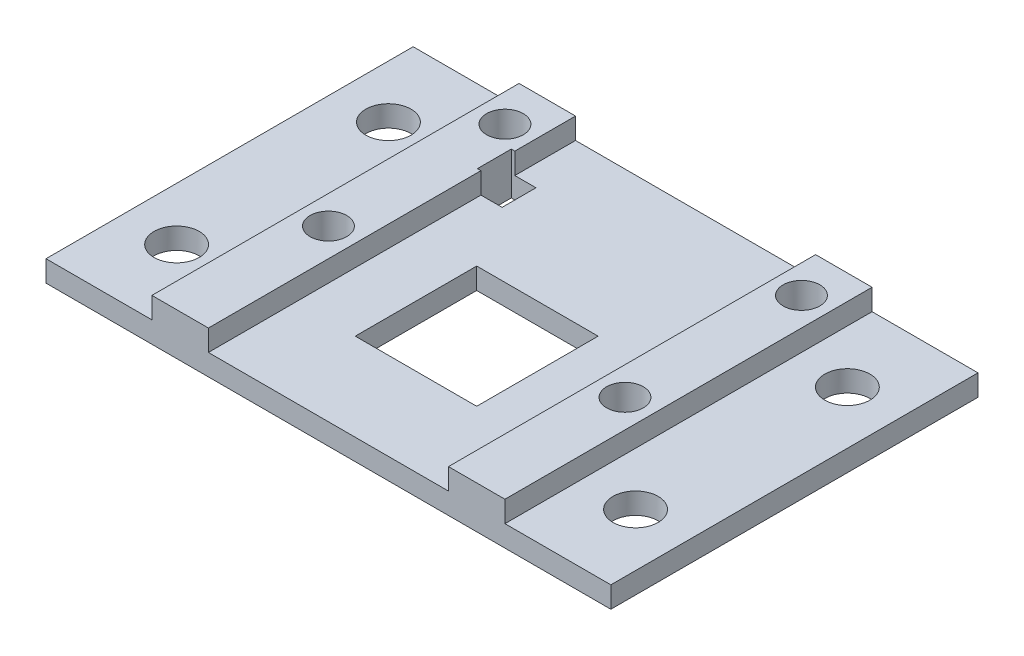
ISO-10303-21;
HEADER;
FILE_DESCRIPTION(('STEP AP214'),'2;1');
FILE_NAME('part.step','',(''),(''),'','','');
FILE_SCHEMA(('AUTOMOTIVE_DESIGN { 1 0 10303 214 1 1 1 1 }'));
ENDSEC;
DATA;
#1=APPLICATION_CONTEXT('core data for automotive mechanical design processes');
#2=APPLICATION_PROTOCOL_DEFINITION('international standard','automotive_design',2000,#1);
#3=PRODUCT_CONTEXT('',#1,'mechanical');
#4=PRODUCT('Part','Part','',(#3));
#5=PRODUCT_RELATED_PRODUCT_CATEGORY('part','',(#4));
#6=PRODUCT_DEFINITION_FORMATION('','',#4);
#7=PRODUCT_DEFINITION_CONTEXT('part definition',#1,'design');
#8=PRODUCT_DEFINITION('design','',#6,#7);
#9=PRODUCT_DEFINITION_SHAPE('','',#8);
#10=(LENGTH_UNIT() NAMED_UNIT(*) SI_UNIT(.MILLI.,.METRE.));
#11=(NAMED_UNIT(*) PLANE_ANGLE_UNIT() SI_UNIT($,.RADIAN.));
#12=(NAMED_UNIT(*) SI_UNIT($,.STERADIAN.) SOLID_ANGLE_UNIT());
#13=UNCERTAINTY_MEASURE_WITH_UNIT(LENGTH_MEASURE(1.E-05),#10,'distance_accuracy_value','');
#14=(GEOMETRIC_REPRESENTATION_CONTEXT(3) GLOBAL_UNCERTAINTY_ASSIGNED_CONTEXT((#13)) GLOBAL_UNIT_ASSIGNED_CONTEXT((#10,
#11,#12)) REPRESENTATION_CONTEXT('',''));
#15=CARTESIAN_POINT('',(0.,0.,0.));
#16=DIRECTION('',(0.,0.,1.));
#17=DIRECTION('',(1.,0.,0.));
#18=AXIS2_PLACEMENT_3D('',#15,#16,#17);
#19=CARTESIAN_POINT('',(-8.5,3.,-13.));
#20=DIRECTION('',(-1.,0.,0.));
#21=DIRECTION('',(0.,0.,1.));
#22=AXIS2_PLACEMENT_3D('',#19,#20,#21);
#23=PLANE('',#22);
#24=DIRECTION('',(0.,0.,-1.));
#25=VECTOR('',#24,1.);
#26=CARTESIAN_POINT('',(-8.5,3.,-13.));
#27=LINE('',#26,#25);
#28=CARTESIAN_POINT('',(-8.5,3.,-8.7));
#29=VERTEX_POINT('',#28);
#30=CARTESIAN_POINT('',(-8.5,3.,-13.));
#31=VERTEX_POINT('',#30);
#32=EDGE_CURVE('E270',#29,#31,#27,.T.);
#33=ORIENTED_EDGE('',*,*,#32,.F.);
#34=DIRECTION('',(0.,-1.,0.));
#35=VECTOR('',#34,1.);
#36=CARTESIAN_POINT('',(-8.5,3.,-8.7));
#37=LINE('',#36,#35);
#38=CARTESIAN_POINT('',(-8.5,1.5,-8.7));
#39=VERTEX_POINT('',#38);
#40=EDGE_CURVE('E41',#29,#39,#37,.T.);
#41=ORIENTED_EDGE('',*,*,#40,.T.);
#42=DIRECTION('',(0.,0.,-1.));
#43=VECTOR('',#42,1.);
#44=CARTESIAN_POINT('',(-8.5,1.5,-13.));
#45=LINE('',#44,#43);
#46=CARTESIAN_POINT('',(-8.5,1.5,-13.));
#47=VERTEX_POINT('',#46);
#48=EDGE_CURVE('E265',#39,#47,#45,.T.);
#49=ORIENTED_EDGE('',*,*,#48,.T.);
#50=DIRECTION('',(0.,-1.,0.));
#51=VECTOR('',#50,1.);
#52=CARTESIAN_POINT('',(-8.5,3.,-13.));
#53=LINE('',#52,#51);
#54=EDGE_CURVE('E348',#31,#47,#53,.T.);
#55=ORIENTED_EDGE('',*,*,#54,.F.);
#56=EDGE_LOOP('',(#33,#41,#49,#55));
#57=FACE_BOUND('',#56,.T.);
#58=ADVANCED_FACE('F32',(#57),#23,.F.);
#59=CARTESIAN_POINT('',(0.,1.5,0.));
#60=DIRECTION('',(0.,-1.,0.));
#61=DIRECTION('',(0.,0.,-1.));
#62=AXIS2_PLACEMENT_3D('',#59,#60,#61);
#63=PLANE('',#62);
#64=CARTESIAN_POINT('',(16.25,1.5,7.5));
#65=DIRECTION('',(0.,1.,0.));
#66=DIRECTION('',(0.,0.,1.));
#67=AXIS2_PLACEMENT_3D('',#64,#65,#66);
#68=CIRCLE('',#67,1.6);
#69=CARTESIAN_POINT('',(16.25,1.5,9.1));
#70=VERTEX_POINT('',#69);
#71=EDGE_CURVE('E297',#70,#70,#68,.T.);
#72=ORIENTED_EDGE('',*,*,#71,.F.);
#73=EDGE_LOOP('',(#72));
#74=FACE_BOUND('',#73,.T.);
#75=CARTESIAN_POINT('',(16.25,1.5,-7.5));
#76=DIRECTION('',(0.,1.,0.));
#77=DIRECTION('',(0.,0.,1.));
#78=AXIS2_PLACEMENT_3D('',#75,#76,#77);
#79=CIRCLE('',#78,1.6);
#80=CARTESIAN_POINT('',(16.25,1.5,-5.9));
#81=VERTEX_POINT('',#80);
#82=EDGE_CURVE('E205',#81,#81,#79,.T.);
#83=ORIENTED_EDGE('',*,*,#82,.F.);
#84=EDGE_LOOP('',(#83));
#85=FACE_BOUND('',#84,.T.);
#86=DIRECTION('',(0.,0.,-1.));
#87=VECTOR('',#86,1.);
#88=CARTESIAN_POINT('',(12.5,1.5,-13.));
#89=LINE('',#88,#87);
#90=CARTESIAN_POINT('',(12.5,1.5,13.));
#91=VERTEX_POINT('',#90);
#92=CARTESIAN_POINT('',(12.5,1.5,-13.));
#93=VERTEX_POINT('',#92);
#94=EDGE_CURVE('E237',#91,#93,#89,.T.);
#95=ORIENTED_EDGE('',*,*,#94,.F.);
#96=DIRECTION('',(1.,0.,0.));
#97=VECTOR('',#96,1.);
#98=CARTESIAN_POINT('',(-20.,1.5,13.));
#99=LINE('',#98,#97);
#100=CARTESIAN_POINT('',(20.,1.5,13.));
#101=VERTEX_POINT('',#100);
#102=EDGE_CURVE('E364',#91,#101,#99,.T.);
#103=ORIENTED_EDGE('',*,*,#102,.T.);
#104=DIRECTION('',(0.,0.,-1.));
#105=VECTOR('',#104,1.);
#106=CARTESIAN_POINT('',(20.,1.5,13.));
#107=LINE('',#106,#105);
#108=CARTESIAN_POINT('',(20.,1.5,-13.));
#109=VERTEX_POINT('',#108);
#110=EDGE_CURVE('E345',#101,#109,#107,.T.);
#111=ORIENTED_EDGE('',*,*,#110,.T.);
#112=DIRECTION('',(-1.,0.,0.));
#113=VECTOR('',#112,1.);
#114=CARTESIAN_POINT('',(-20.,1.5,-13.));
#115=LINE('',#114,#113);
#116=EDGE_CURVE('E379',#109,#93,#115,.T.);
#117=ORIENTED_EDGE('',*,*,#116,.T.);
#118=EDGE_LOOP('',(#95,#103,#111,#117));
#119=FACE_BOUND('',#118,.T.);
#120=ADVANCED_FACE('F321',(#74,#85,#119),#63,.F.);
#121=DIRECTION('',(0.,0.,1.));
#122=VECTOR('',#121,1.);
#123=CARTESIAN_POINT('',(-4.29999999999999,1.5,-1.8));
#124=LINE('',#123,#122);
#125=CARTESIAN_POINT('',(-4.29999999999999,1.5,-1.8));
#126=VERTEX_POINT('',#125);
#127=CARTESIAN_POINT('',(-4.29999999999999,1.5,6.8));
#128=VERTEX_POINT('',#127);
#129=EDGE_CURVE('E421',#126,#128,#124,.T.);
#130=ORIENTED_EDGE('',*,*,#129,.F.);
#131=DIRECTION('',(-1.,0.,0.));
#132=VECTOR('',#131,1.);
#133=CARTESIAN_POINT('',(4.30000000000001,1.5,-1.8));
#134=LINE('',#133,#132);
#135=CARTESIAN_POINT('',(4.30000000000001,1.5,-1.8));
#136=VERTEX_POINT('',#135);
#137=EDGE_CURVE('E417',#136,#126,#134,.T.);
#138=ORIENTED_EDGE('',*,*,#137,.F.);
#139=DIRECTION('',(0.,0.,-1.));
#140=VECTOR('',#139,1.);
#141=CARTESIAN_POINT('',(4.30000000000001,1.5,6.8));
#142=LINE('',#141,#140);
#143=CARTESIAN_POINT('',(4.30000000000001,1.5,6.8));
#144=VERTEX_POINT('',#143);
#145=EDGE_CURVE('E432',#144,#136,#142,.T.);
#146=ORIENTED_EDGE('',*,*,#145,.F.);
#147=DIRECTION('',(1.,0.,0.));
#148=VECTOR('',#147,1.);
#149=CARTESIAN_POINT('',(-4.29999999999999,1.5,6.8));
#150=LINE('',#149,#148);
#151=EDGE_CURVE('E435',#128,#144,#150,.T.);
#152=ORIENTED_EDGE('',*,*,#151,.F.);
#153=EDGE_LOOP('',(#130,#138,#146,#152));
#154=FACE_BOUND('',#153,.T.);
#155=ORIENTED_EDGE('',*,*,#48,.F.);
#156=DIRECTION('',(1.,0.,0.));
#157=VECTOR('',#156,1.);
#158=CARTESIAN_POINT('',(0.,1.5,-8.7));
#159=LINE('',#158,#157);
#160=CARTESIAN_POINT('',(-7.,1.5,-8.7));
#161=VERTEX_POINT('',#160);
#162=EDGE_CURVE('E224',#39,#161,#159,.T.);
#163=ORIENTED_EDGE('',*,*,#162,.T.);
#164=DIRECTION('',(0.,0.,1.));
#165=VECTOR('',#164,1.);
#166=CARTESIAN_POINT('',(-7.,1.5,0.));
#167=LINE('',#166,#165);
#168=CARTESIAN_POINT('',(-7.,1.5,-6.3));
#169=VERTEX_POINT('',#168);
#170=EDGE_CURVE('E227',#161,#169,#167,.T.);
#171=ORIENTED_EDGE('',*,*,#170,.T.);
#172=DIRECTION('',(-1.,0.,0.));
#173=VECTOR('',#172,1.);
#174=CARTESIAN_POINT('',(0.,1.5,-6.3));
#175=LINE('',#174,#173);
#176=CARTESIAN_POINT('',(-8.5,1.5,-6.3));
#177=VERTEX_POINT('',#176);
#178=EDGE_CURVE('E219',#169,#177,#175,.T.);
#179=ORIENTED_EDGE('',*,*,#178,.T.);
#180=CARTESIAN_POINT('',(-8.5,1.5,13.));
#181=VERTEX_POINT('',#180);
#182=EDGE_CURVE('E283',#181,#177,#45,.T.);
#183=ORIENTED_EDGE('',*,*,#182,.F.);
#184=CARTESIAN_POINT('',(8.5,1.5,13.));
#185=VERTEX_POINT('',#184);
#186=EDGE_CURVE('E361',#181,#185,#99,.T.);
#187=ORIENTED_EDGE('',*,*,#186,.T.);
#188=DIRECTION('',(0.,0.,1.));
#189=VECTOR('',#188,1.);
#190=CARTESIAN_POINT('',(8.5,1.5,-13.));
#191=LINE('',#190,#189);
#192=CARTESIAN_POINT('',(8.5,1.5,-13.));
#193=VERTEX_POINT('',#192);
#194=EDGE_CURVE('E243',#193,#185,#191,.T.);
#195=ORIENTED_EDGE('',*,*,#194,.F.);
#196=EDGE_CURVE('E344',#193,#47,#115,.T.);
#197=ORIENTED_EDGE('',*,*,#196,.T.);
#198=EDGE_LOOP('',(#155,#163,#171,#179,#183,#187,#195,#197));
#199=FACE_BOUND('',#198,.T.);
#200=ADVANCED_FACE('F319',(#154,#199),#63,.F.);
#201=CARTESIAN_POINT('',(-16.25,1.5,-7.5));
#202=DIRECTION('',(0.,1.,0.));
#203=DIRECTION('',(0.,0.,1.));
#204=AXIS2_PLACEMENT_3D('',#201,#202,#203);
#205=CIRCLE('',#204,1.6);
#206=CARTESIAN_POINT('',(-16.25,1.5,-5.9));
#207=VERTEX_POINT('',#206);
#208=EDGE_CURVE('E309',#207,#207,#205,.T.);
#209=ORIENTED_EDGE('',*,*,#208,.F.);
#210=EDGE_LOOP('',(#209));
#211=FACE_BOUND('',#210,.T.);
#212=CARTESIAN_POINT('',(-16.25,1.5,7.5));
#213=DIRECTION('',(0.,1.,0.));
#214=DIRECTION('',(0.,0.,1.));
#215=AXIS2_PLACEMENT_3D('',#212,#213,#214);
#216=CIRCLE('',#215,1.6);
#217=CARTESIAN_POINT('',(-16.25,1.5,9.1));
#218=VERTEX_POINT('',#217);
#219=EDGE_CURVE('E300',#218,#218,#216,.T.);
#220=ORIENTED_EDGE('',*,*,#219,.F.);
#221=EDGE_LOOP('',(#220));
#222=FACE_BOUND('',#221,.T.);
#223=DIRECTION('',(0.,0.,1.));
#224=VECTOR('',#223,1.);
#225=CARTESIAN_POINT('',(-12.5,1.5,-13.));
#226=LINE('',#225,#224);
#227=CARTESIAN_POINT('',(-12.5,1.5,-13.));
#228=VERTEX_POINT('',#227);
#229=CARTESIAN_POINT('',(-12.5,1.5,13.));
#230=VERTEX_POINT('',#229);
#231=EDGE_CURVE('E324',#228,#230,#226,.T.);
#232=ORIENTED_EDGE('',*,*,#231,.F.);
#233=CARTESIAN_POINT('',(-20.,1.5,-13.));
#234=VERTEX_POINT('',#233);
#235=EDGE_CURVE('E326',#228,#234,#115,.T.);
#236=ORIENTED_EDGE('',*,*,#235,.T.);
#237=DIRECTION('',(0.,0.,1.));
#238=VECTOR('',#237,1.);
#239=CARTESIAN_POINT('',(-20.,1.5,13.));
#240=LINE('',#239,#238);
#241=CARTESIAN_POINT('',(-20.,1.5,13.));
#242=VERTEX_POINT('',#241);
#243=EDGE_CURVE('E368',#234,#242,#240,.T.);
#244=ORIENTED_EDGE('',*,*,#243,.T.);
#245=EDGE_CURVE('E329',#242,#230,#99,.T.);
#246=ORIENTED_EDGE('',*,*,#245,.T.);
#247=EDGE_LOOP('',(#232,#236,#244,#246));
#248=FACE_BOUND('',#247,.T.);
#249=ADVANCED_FACE('F316',(#211,#222,#248),#63,.F.);
#250=CARTESIAN_POINT('',(0.,0.,0.));
#251=DIRECTION('',(0.,-1.,0.));
#252=DIRECTION('',(0.,0.,-1.));
#253=AXIS2_PLACEMENT_3D('',#250,#251,#252);
#254=PLANE('',#253);
#255=CARTESIAN_POINT('',(-16.25,0.,-7.5));
#256=DIRECTION('',(0.,-1.,0.));
#257=DIRECTION('',(0.,0.,-1.));
#258=AXIS2_PLACEMENT_3D('',#255,#256,#257);
#259=CIRCLE('',#258,1.6);
#260=CARTESIAN_POINT('',(-16.25,0.,-9.1));
#261=VERTEX_POINT('',#260);
#262=EDGE_CURVE('E36',#261,#261,#259,.T.);
#263=ORIENTED_EDGE('',*,*,#262,.F.);
#264=EDGE_LOOP('',(#263));
#265=FACE_BOUND('',#264,.T.);
#266=CARTESIAN_POINT('',(-16.25,0.,7.5));
#267=DIRECTION('',(0.,-1.,0.));
#268=DIRECTION('',(0.,0.,-1.));
#269=AXIS2_PLACEMENT_3D('',#266,#267,#268);
#270=CIRCLE('',#269,1.6);
#271=CARTESIAN_POINT('',(-16.25,0.,5.9));
#272=VERTEX_POINT('',#271);
#273=EDGE_CURVE('E298',#272,#272,#270,.T.);
#274=ORIENTED_EDGE('',*,*,#273,.F.);
#275=EDGE_LOOP('',(#274));
#276=FACE_BOUND('',#275,.T.);
#277=CARTESIAN_POINT('',(16.25,0.,7.5));
#278=DIRECTION('',(0.,-1.,0.));
#279=DIRECTION('',(0.,0.,-1.));
#280=AXIS2_PLACEMENT_3D('',#277,#278,#279);
#281=CIRCLE('',#280,1.6);
#282=CARTESIAN_POINT('',(16.25,0.,5.9));
#283=VERTEX_POINT('',#282);
#284=EDGE_CURVE('E295',#283,#283,#281,.T.);
#285=ORIENTED_EDGE('',*,*,#284,.F.);
#286=EDGE_LOOP('',(#285));
#287=FACE_BOUND('',#286,.T.);
#288=CARTESIAN_POINT('',(16.25,0.,-7.5));
#289=DIRECTION('',(0.,-1.,0.));
#290=DIRECTION('',(0.,0.,-1.));
#291=AXIS2_PLACEMENT_3D('',#288,#289,#290);
#292=CIRCLE('',#291,1.6);
#293=CARTESIAN_POINT('',(16.25,0.,-9.1));
#294=VERTEX_POINT('',#293);
#295=EDGE_CURVE('E202',#294,#294,#292,.T.);
#296=ORIENTED_EDGE('',*,*,#295,.F.);
#297=EDGE_LOOP('',(#296));
#298=FACE_BOUND('',#297,.T.);
#299=DIRECTION('',(0.,0.,1.));
#300=VECTOR('',#299,1.);
#301=CARTESIAN_POINT('',(-8.75,0.,-8.7));
#302=LINE('',#301,#300);
#303=CARTESIAN_POINT('',(-8.75,0.,-8.7));
#304=VERTEX_POINT('',#303);
#305=CARTESIAN_POINT('',(-8.75,0.,-6.3));
#306=VERTEX_POINT('',#305);
#307=EDGE_CURVE('E188',#304,#306,#302,.T.);
#308=ORIENTED_EDGE('',*,*,#307,.T.);
#309=DIRECTION('',(1.,0.,0.));
#310=VECTOR('',#309,1.);
#311=CARTESIAN_POINT('',(-8.75,0.,-6.3));
#312=LINE('',#311,#310);
#313=CARTESIAN_POINT('',(-7.,0.,-6.3));
#314=VERTEX_POINT('',#313);
#315=EDGE_CURVE('E195',#306,#314,#312,.T.);
#316=ORIENTED_EDGE('',*,*,#315,.T.);
#317=DIRECTION('',(0.,0.,-1.));
#318=VECTOR('',#317,1.);
#319=CARTESIAN_POINT('',(-7.,0.,-8.7));
#320=LINE('',#319,#318);
#321=CARTESIAN_POINT('',(-7.,0.,-8.7));
#322=VERTEX_POINT('',#321);
#323=EDGE_CURVE('E49',#314,#322,#320,.T.);
#324=ORIENTED_EDGE('',*,*,#323,.T.);
#325=DIRECTION('',(-1.,0.,0.));
#326=VECTOR('',#325,1.);
#327=CARTESIAN_POINT('',(-8.75,0.,-8.7));
#328=LINE('',#327,#326);
#329=EDGE_CURVE('E192',#322,#304,#328,.T.);
#330=ORIENTED_EDGE('',*,*,#329,.T.);
#331=EDGE_LOOP('',(#308,#316,#324,#330));
#332=FACE_BOUND('',#331,.T.);
#333=CARTESIAN_POINT('',(10.5,0.,-10.));
#334=DIRECTION('',(0.,1.,0.));
#335=DIRECTION('',(0.,0.,1.));
#336=AXIS2_PLACEMENT_3D('',#333,#334,#335);
#337=CIRCLE('',#336,1.3);
#338=CARTESIAN_POINT('',(10.5,0.,-8.69999999999999));
#339=VERTEX_POINT('',#338);
#340=EDGE_CURVE('E443',#339,#339,#337,.T.);
#341=ORIENTED_EDGE('',*,*,#340,.T.);
#342=EDGE_LOOP('',(#341));
#343=FACE_BOUND('',#342,.T.);
#344=CARTESIAN_POINT('',(-10.5,0.,2.5));
#345=DIRECTION('',(0.,1.,0.));
#346=DIRECTION('',(0.,0.,1.));
#347=AXIS2_PLACEMENT_3D('',#344,#345,#346);
#348=CIRCLE('',#347,1.3);
#349=CARTESIAN_POINT('',(-10.5,0.,3.80000000000001));
#350=VERTEX_POINT('',#349);
#351=EDGE_CURVE('E430',#350,#350,#348,.T.);
#352=ORIENTED_EDGE('',*,*,#351,.T.);
#353=EDGE_LOOP('',(#352));
#354=FACE_BOUND('',#353,.T.);
#355=DIRECTION('',(0.,0.,-1.));
#356=VECTOR('',#355,1.);
#357=CARTESIAN_POINT('',(20.,0.,13.));
#358=LINE('',#357,#356);
#359=CARTESIAN_POINT('',(20.,0.,13.));
#360=VERTEX_POINT('',#359);
#361=CARTESIAN_POINT('',(20.,0.,-13.));
#362=VERTEX_POINT('',#361);
#363=EDGE_CURVE('E370',#360,#362,#358,.T.);
#364=ORIENTED_EDGE('',*,*,#363,.F.);
#365=DIRECTION('',(1.,0.,0.));
#366=VECTOR('',#365,1.);
#367=CARTESIAN_POINT('',(-20.,0.,13.));
#368=LINE('',#367,#366);
#369=CARTESIAN_POINT('',(-20.,0.,13.));
#370=VERTEX_POINT('',#369);
#371=EDGE_CURVE('E396',#370,#360,#368,.T.);
#372=ORIENTED_EDGE('',*,*,#371,.F.);
#373=DIRECTION('',(0.,0.,1.));
#374=VECTOR('',#373,1.);
#375=CARTESIAN_POINT('',(-20.,0.,13.));
#376=LINE('',#375,#374);
#377=CARTESIAN_POINT('',(-20.,0.,-13.));
#378=VERTEX_POINT('',#377);
#379=EDGE_CURVE('E398',#378,#370,#376,.T.);
#380=ORIENTED_EDGE('',*,*,#379,.F.);
#381=DIRECTION('',(-1.,0.,0.));
#382=VECTOR('',#381,1.);
#383=CARTESIAN_POINT('',(-20.,0.,-13.));
#384=LINE('',#383,#382);
#385=EDGE_CURVE('E399',#362,#378,#384,.T.);
#386=ORIENTED_EDGE('',*,*,#385,.F.);
#387=EDGE_LOOP('',(#364,#372,#380,#386));
#388=FACE_BOUND('',#387,.T.);
#389=DIRECTION('',(-1.,0.,0.));
#390=VECTOR('',#389,1.);
#391=CARTESIAN_POINT('',(4.30000000000001,0.,-1.8));
#392=LINE('',#391,#390);
#393=CARTESIAN_POINT('',(4.30000000000001,0.,-1.8));
#394=VERTEX_POINT('',#393);
#395=CARTESIAN_POINT('',(-4.29999999999999,0.,-1.8));
#396=VERTEX_POINT('',#395);
#397=EDGE_CURVE('E418',#394,#396,#392,.T.);
#398=ORIENTED_EDGE('',*,*,#397,.T.);
#399=DIRECTION('',(0.,0.,1.));
#400=VECTOR('',#399,1.);
#401=CARTESIAN_POINT('',(-4.29999999999999,0.,-1.8));
#402=LINE('',#401,#400);
#403=CARTESIAN_POINT('',(-4.29999999999999,0.,6.8));
#404=VERTEX_POINT('',#403);
#405=EDGE_CURVE('E428',#396,#404,#402,.T.);
#406=ORIENTED_EDGE('',*,*,#405,.T.);
#407=DIRECTION('',(1.,0.,0.));
#408=VECTOR('',#407,1.);
#409=CARTESIAN_POINT('',(-4.29999999999999,0.,6.8));
#410=LINE('',#409,#408);
#411=CARTESIAN_POINT('',(4.30000000000001,0.,6.8));
#412=VERTEX_POINT('',#411);
#413=EDGE_CURVE('E425',#404,#412,#410,.T.);
#414=ORIENTED_EDGE('',*,*,#413,.T.);
#415=DIRECTION('',(0.,0.,-1.));
#416=VECTOR('',#415,1.);
#417=CARTESIAN_POINT('',(4.30000000000001,0.,6.8));
#418=LINE('',#417,#416);
#419=EDGE_CURVE('E422',#412,#394,#418,.T.);
#420=ORIENTED_EDGE('',*,*,#419,.T.);
#421=EDGE_LOOP('',(#398,#406,#414,#420));
#422=FACE_BOUND('',#421,.T.);
#423=CARTESIAN_POINT('',(-10.5,0.,-10.));
#424=DIRECTION('',(0.,1.,0.));
#425=DIRECTION('',(0.,0.,1.));
#426=AXIS2_PLACEMENT_3D('',#423,#424,#425);
#427=CIRCLE('',#426,1.3);
#428=CARTESIAN_POINT('',(-10.5,0.,-8.69999999999999));
#429=VERTEX_POINT('',#428);
#430=EDGE_CURVE('E440',#429,#429,#427,.T.);
#431=ORIENTED_EDGE('',*,*,#430,.T.);
#432=EDGE_LOOP('',(#431));
#433=FACE_BOUND('',#432,.T.);
#434=CARTESIAN_POINT('',(10.5,0.,2.5));
#435=DIRECTION('',(0.,1.,0.));
#436=DIRECTION('',(0.,0.,1.));
#437=AXIS2_PLACEMENT_3D('',#434,#435,#436);
#438=CIRCLE('',#437,1.3);
#439=CARTESIAN_POINT('',(10.5,0.,3.80000000000001));
#440=VERTEX_POINT('',#439);
#441=EDGE_CURVE('E352',#440,#440,#438,.T.);
#442=ORIENTED_EDGE('',*,*,#441,.T.);
#443=EDGE_LOOP('',(#442));
#444=FACE_BOUND('',#443,.T.);
#445=ADVANCED_FACE('F199',(#265,#276,#287,#298,#332,#343,#354,#388,#422,#433,#444),#254,.T.);
#446=CARTESIAN_POINT('',(20.,1.5,13.));
#447=DIRECTION('',(-1.,0.,0.));
#448=DIRECTION('',(0.,0.,1.));
#449=AXIS2_PLACEMENT_3D('',#446,#447,#448);
#450=PLANE('',#449);
#451=ORIENTED_EDGE('',*,*,#363,.T.);
#452=DIRECTION('',(0.,-1.,0.));
#453=VECTOR('',#452,1.);
#454=CARTESIAN_POINT('',(20.,1.5,-13.));
#455=LINE('',#454,#453);
#456=EDGE_CURVE('E292',#109,#362,#455,.T.);
#457=ORIENTED_EDGE('',*,*,#456,.F.);
#458=ORIENTED_EDGE('',*,*,#110,.F.);
#459=DIRECTION('',(0.,-1.,0.));
#460=VECTOR('',#459,1.);
#461=CARTESIAN_POINT('',(20.,1.5,13.));
#462=LINE('',#461,#460);
#463=EDGE_CURVE('E393',#101,#360,#462,.T.);
#464=ORIENTED_EDGE('',*,*,#463,.T.);
#465=EDGE_LOOP('',(#451,#457,#458,#464));
#466=FACE_BOUND('',#465,.T.);
#467=ADVANCED_FACE('F34',(#466),#450,.F.);
#468=CARTESIAN_POINT('',(-20.,1.5,-13.));
#469=DIRECTION('',(0.,0.,1.));
#470=DIRECTION('',(1.,0.,0.));
#471=AXIS2_PLACEMENT_3D('',#468,#469,#470);
#472=PLANE('',#471);
#473=ORIENTED_EDGE('',*,*,#385,.T.);
#474=DIRECTION('',(0.,-1.,0.));
#475=VECTOR('',#474,1.);
#476=CARTESIAN_POINT('',(-20.,1.5,-13.));
#477=LINE('',#476,#475);
#478=EDGE_CURVE('E342',#234,#378,#477,.T.);
#479=ORIENTED_EDGE('',*,*,#478,.F.);
#480=ORIENTED_EDGE('',*,*,#235,.F.);
#481=DIRECTION('',(0.,-1.,0.));
#482=VECTOR('',#481,1.);
#483=CARTESIAN_POINT('',(-12.5,3.,-13.));
#484=LINE('',#483,#482);
#485=CARTESIAN_POINT('',(-12.5,3.,-13.));
#486=VERTEX_POINT('',#485);
#487=EDGE_CURVE('E339',#486,#228,#484,.T.);
#488=ORIENTED_EDGE('',*,*,#487,.F.);
#489=DIRECTION('',(-1.,0.,0.));
#490=VECTOR('',#489,1.);
#491=CARTESIAN_POINT('',(-12.5,3.,-13.));
#492=LINE('',#491,#490);
#493=EDGE_CURVE('E269',#31,#486,#492,.T.);
#494=ORIENTED_EDGE('',*,*,#493,.F.);
#495=ORIENTED_EDGE('',*,*,#54,.T.);
#496=ORIENTED_EDGE('',*,*,#196,.F.);
#497=DIRECTION('',(0.,-1.,0.));
#498=VECTOR('',#497,1.);
#499=CARTESIAN_POINT('',(8.5,3.,-13.));
#500=LINE('',#499,#498);
#501=CARTESIAN_POINT('',(8.5,3.,-13.));
#502=VERTEX_POINT('',#501);
#503=EDGE_CURVE('E259',#502,#193,#500,.T.);
#504=ORIENTED_EDGE('',*,*,#503,.F.);
#505=DIRECTION('',(-1.,0.,0.));
#506=VECTOR('',#505,1.);
#507=CARTESIAN_POINT('',(12.5,3.,-13.));
#508=LINE('',#507,#506);
#509=CARTESIAN_POINT('',(12.5,3.,-13.));
#510=VERTEX_POINT('',#509);
#511=EDGE_CURVE('E242',#510,#502,#508,.T.);
#512=ORIENTED_EDGE('',*,*,#511,.F.);
#513=DIRECTION('',(0.,-1.,0.));
#514=VECTOR('',#513,1.);
#515=CARTESIAN_POINT('',(12.5,3.,-13.));
#516=LINE('',#515,#514);
#517=EDGE_CURVE('E262',#510,#93,#516,.T.);
#518=ORIENTED_EDGE('',*,*,#517,.T.);
#519=ORIENTED_EDGE('',*,*,#116,.F.);
#520=ORIENTED_EDGE('',*,*,#456,.T.);
#521=EDGE_LOOP('',(#473,#479,#480,#488,#494,#495,#496,#504,#512,#518,#519,#520));
#522=FACE_BOUND('',#521,.T.);
#523=ADVANCED_FACE('F337',(#522),#472,.F.);
#524=CARTESIAN_POINT('',(-20.,1.5,13.));
#525=DIRECTION('',(1.,0.,0.));
#526=DIRECTION('',(0.,0.,-1.));
#527=AXIS2_PLACEMENT_3D('',#524,#525,#526);
#528=PLANE('',#527);
#529=ORIENTED_EDGE('',*,*,#379,.T.);
#530=DIRECTION('',(0.,-1.,0.));
#531=VECTOR('',#530,1.);
#532=CARTESIAN_POINT('',(-20.,1.5,13.));
#533=LINE('',#532,#531);
#534=EDGE_CURVE('E390',#242,#370,#533,.T.);
#535=ORIENTED_EDGE('',*,*,#534,.F.);
#536=ORIENTED_EDGE('',*,*,#243,.F.);
#537=ORIENTED_EDGE('',*,*,#478,.T.);
#538=EDGE_LOOP('',(#529,#535,#536,#537));
#539=FACE_BOUND('',#538,.T.);
#540=ADVANCED_FACE('F570',(#539),#528,.F.);
#541=CARTESIAN_POINT('',(-20.,1.5,13.));
#542=DIRECTION('',(0.,0.,-1.));
#543=DIRECTION('',(-1.,0.,0.));
#544=AXIS2_PLACEMENT_3D('',#541,#542,#543);
#545=PLANE('',#544);
#546=ORIENTED_EDGE('',*,*,#371,.T.);
#547=ORIENTED_EDGE('',*,*,#463,.F.);
#548=ORIENTED_EDGE('',*,*,#102,.F.);
#549=DIRECTION('',(0.,-1.,0.));
#550=VECTOR('',#549,1.);
#551=CARTESIAN_POINT('',(12.5,3.,13.));
#552=LINE('',#551,#550);
#553=CARTESIAN_POINT('',(12.5,3.,13.));
#554=VERTEX_POINT('',#553);
#555=EDGE_CURVE('E249',#554,#91,#552,.T.);
#556=ORIENTED_EDGE('',*,*,#555,.F.);
#557=DIRECTION('',(1.,0.,0.));
#558=VECTOR('',#557,1.);
#559=CARTESIAN_POINT('',(12.5,3.,13.));
#560=LINE('',#559,#558);
#561=CARTESIAN_POINT('',(8.50000000000001,3.,13.));
#562=VERTEX_POINT('',#561);
#563=EDGE_CURVE('E247',#562,#554,#560,.T.);
#564=ORIENTED_EDGE('',*,*,#563,.F.);
#565=DIRECTION('',(0.,-1.,0.));
#566=VECTOR('',#565,1.);
#567=CARTESIAN_POINT('',(8.50000000000001,3.,13.));
#568=LINE('',#567,#566);
#569=EDGE_CURVE('E256',#562,#185,#568,.T.);
#570=ORIENTED_EDGE('',*,*,#569,.T.);
#571=ORIENTED_EDGE('',*,*,#186,.F.);
#572=DIRECTION('',(0.,-1.,0.));
#573=VECTOR('',#572,1.);
#574=CARTESIAN_POINT('',(-8.5,3.,13.));
#575=LINE('',#574,#573);
#576=CARTESIAN_POINT('',(-8.5,3.,13.));
#577=VERTEX_POINT('',#576);
#578=EDGE_CURVE('E276',#577,#181,#575,.T.);
#579=ORIENTED_EDGE('',*,*,#578,.F.);
#580=DIRECTION('',(1.,0.,0.));
#581=VECTOR('',#580,1.);
#582=CARTESIAN_POINT('',(-12.5,3.,13.));
#583=LINE('',#582,#581);
#584=CARTESIAN_POINT('',(-12.5,3.,13.));
#585=VERTEX_POINT('',#584);
#586=EDGE_CURVE('E274',#585,#577,#583,.T.);
#587=ORIENTED_EDGE('',*,*,#586,.F.);
#588=DIRECTION('',(0.,-1.,0.));
#589=VECTOR('',#588,1.);
#590=CARTESIAN_POINT('',(-12.5,3.,13.));
#591=LINE('',#590,#589);
#592=EDGE_CURVE('E349',#585,#230,#591,.T.);
#593=ORIENTED_EDGE('',*,*,#592,.T.);
#594=ORIENTED_EDGE('',*,*,#245,.F.);
#595=ORIENTED_EDGE('',*,*,#534,.T.);
#596=EDGE_LOOP('',(#546,#547,#548,#556,#564,#570,#571,#579,#587,#593,#594,#595));
#597=FACE_BOUND('',#596,.T.);
#598=ADVANCED_FACE('F503',(#597),#545,.F.);
#599=CARTESIAN_POINT('',(-4.29999999999999,1.5,-1.8));
#600=DIRECTION('',(1.,0.,0.));
#601=DIRECTION('',(0.,0.,-1.));
#602=AXIS2_PLACEMENT_3D('',#599,#600,#601);
#603=PLANE('',#602);
#604=ORIENTED_EDGE('',*,*,#405,.F.);
#605=DIRECTION('',(0.,-1.,0.));
#606=VECTOR('',#605,1.);
#607=CARTESIAN_POINT('',(-4.29999999999999,1.5,-1.8));
#608=LINE('',#607,#606);
#609=EDGE_CURVE('E414',#126,#396,#608,.T.);
#610=ORIENTED_EDGE('',*,*,#609,.F.);
#611=ORIENTED_EDGE('',*,*,#129,.T.);
#612=DIRECTION('',(0.,-1.,0.));
#613=VECTOR('',#612,1.);
#614=CARTESIAN_POINT('',(-4.29999999999999,1.5,6.8));
#615=LINE('',#614,#613);
#616=EDGE_CURVE('E401',#128,#404,#615,.T.);
#617=ORIENTED_EDGE('',*,*,#616,.T.);
#618=EDGE_LOOP('',(#604,#610,#611,#617));
#619=FACE_BOUND('',#618,.T.);
#620=ADVANCED_FACE('F561',(#619),#603,.T.);
#621=CARTESIAN_POINT('',(-4.29999999999999,1.5,6.8));
#622=DIRECTION('',(0.,0.,-1.));
#623=DIRECTION('',(-1.,0.,0.));
#624=AXIS2_PLACEMENT_3D('',#621,#622,#623);
#625=PLANE('',#624);
#626=ORIENTED_EDGE('',*,*,#413,.F.);
#627=ORIENTED_EDGE('',*,*,#616,.F.);
#628=ORIENTED_EDGE('',*,*,#151,.T.);
#629=DIRECTION('',(0.,-1.,0.));
#630=VECTOR('',#629,1.);
#631=CARTESIAN_POINT('',(4.30000000000001,1.5,6.8));
#632=LINE('',#631,#630);
#633=EDGE_CURVE('E406',#144,#412,#632,.T.);
#634=ORIENTED_EDGE('',*,*,#633,.T.);
#635=EDGE_LOOP('',(#626,#627,#628,#634));
#636=FACE_BOUND('',#635,.T.);
#637=ADVANCED_FACE('F557',(#636),#625,.T.);
#638=CARTESIAN_POINT('',(4.30000000000001,1.5,6.8));
#639=DIRECTION('',(-1.,0.,0.));
#640=DIRECTION('',(0.,0.,1.));
#641=AXIS2_PLACEMENT_3D('',#638,#639,#640);
#642=PLANE('',#641);
#643=ORIENTED_EDGE('',*,*,#419,.F.);
#644=ORIENTED_EDGE('',*,*,#633,.F.);
#645=ORIENTED_EDGE('',*,*,#145,.T.);
#646=DIRECTION('',(0.,-1.,0.));
#647=VECTOR('',#646,1.);
#648=CARTESIAN_POINT('',(4.30000000000001,1.5,-1.8));
#649=LINE('',#648,#647);
#650=EDGE_CURVE('E410',#136,#394,#649,.T.);
#651=ORIENTED_EDGE('',*,*,#650,.T.);
#652=EDGE_LOOP('',(#643,#644,#645,#651));
#653=FACE_BOUND('',#652,.T.);
#654=ADVANCED_FACE('F550',(#653),#642,.T.);
#655=CARTESIAN_POINT('',(4.30000000000001,1.5,-1.8));
#656=DIRECTION('',(0.,0.,1.));
#657=DIRECTION('',(1.,0.,0.));
#658=AXIS2_PLACEMENT_3D('',#655,#656,#657);
#659=PLANE('',#658);
#660=ORIENTED_EDGE('',*,*,#397,.F.);
#661=ORIENTED_EDGE('',*,*,#650,.F.);
#662=ORIENTED_EDGE('',*,*,#137,.T.);
#663=ORIENTED_EDGE('',*,*,#609,.T.);
#664=EDGE_LOOP('',(#660,#661,#662,#663));
#665=FACE_BOUND('',#664,.T.);
#666=ADVANCED_FACE('F544',(#665),#659,.T.);
#667=CARTESIAN_POINT('',(-10.5,1.5,2.5));
#668=DIRECTION('',(0.,-1.,0.));
#669=DIRECTION('',(0.,0.,-1.));
#670=AXIS2_PLACEMENT_3D('',#667,#668,#669);
#671=CYLINDRICAL_SURFACE('',#670,1.3);
#672=ORIENTED_EDGE('',*,*,#351,.F.);
#673=EDGE_LOOP('',(#672));
#674=FACE_BOUND('',#673,.T.);
#675=CARTESIAN_POINT('',(-10.5,3.,2.5));
#676=DIRECTION('',(0.,1.,0.));
#677=DIRECTION('',(0.,0.,1.));
#678=AXIS2_PLACEMENT_3D('',#675,#676,#677);
#679=CIRCLE('',#678,1.3);
#680=CARTESIAN_POINT('',(-10.5,3.,3.80000000000001));
#681=VERTEX_POINT('',#680);
#682=EDGE_CURVE('E234',#681,#681,#679,.T.);
#683=ORIENTED_EDGE('',*,*,#682,.T.);
#684=EDGE_LOOP('',(#683));
#685=FACE_BOUND('',#684,.T.);
#686=ADVANCED_FACE('F471',(#674,#685),#671,.F.);
#687=CARTESIAN_POINT('',(-10.5,1.5,-10.));
#688=DIRECTION('',(0.,-1.,0.));
#689=DIRECTION('',(0.,0.,-1.));
#690=AXIS2_PLACEMENT_3D('',#687,#688,#689);
#691=CYLINDRICAL_SURFACE('',#690,1.3);
#692=ORIENTED_EDGE('',*,*,#430,.F.);
#693=EDGE_LOOP('',(#692));
#694=FACE_BOUND('',#693,.T.);
#695=CARTESIAN_POINT('',(-10.5,3.,-10.));
#696=DIRECTION('',(0.,1.,0.));
#697=DIRECTION('',(0.,0.,1.));
#698=AXIS2_PLACEMENT_3D('',#695,#696,#697);
#699=CIRCLE('',#698,1.3);
#700=CARTESIAN_POINT('',(-10.5,3.,-8.7));
#701=VERTEX_POINT('',#700);
#702=EDGE_CURVE('E230',#701,#701,#699,.T.);
#703=ORIENTED_EDGE('',*,*,#702,.T.);
#704=EDGE_LOOP('',(#703));
#705=FACE_BOUND('',#704,.T.);
#706=ADVANCED_FACE('F465',(#694,#705),#691,.F.);
#707=CARTESIAN_POINT('',(10.5,1.5,-10.));
#708=DIRECTION('',(0.,-1.,0.));
#709=DIRECTION('',(0.,0.,-1.));
#710=AXIS2_PLACEMENT_3D('',#707,#708,#709);
#711=CYLINDRICAL_SURFACE('',#710,1.3);
#712=ORIENTED_EDGE('',*,*,#340,.F.);
#713=EDGE_LOOP('',(#712));
#714=FACE_BOUND('',#713,.T.);
#715=CARTESIAN_POINT('',(10.5,3.,-10.));
#716=DIRECTION('',(0.,-1.,0.));
#717=DIRECTION('',(0.,0.,-1.));
#718=AXIS2_PLACEMENT_3D('',#715,#716,#717);
#719=CIRCLE('',#718,1.3);
#720=CARTESIAN_POINT('',(10.5,3.,-11.3));
#721=VERTEX_POINT('',#720);
#722=EDGE_CURVE('E238',#721,#721,#719,.T.);
#723=ORIENTED_EDGE('',*,*,#722,.F.);
#724=EDGE_LOOP('',(#723));
#725=FACE_BOUND('',#724,.T.);
#726=ADVANCED_FACE('F453',(#714,#725),#711,.F.);
#727=CARTESIAN_POINT('',(10.5,1.5,2.5));
#728=DIRECTION('',(0.,-1.,0.));
#729=DIRECTION('',(0.,0.,-1.));
#730=AXIS2_PLACEMENT_3D('',#727,#728,#729);
#731=CYLINDRICAL_SURFACE('',#730,1.3);
#732=ORIENTED_EDGE('',*,*,#441,.F.);
#733=EDGE_LOOP('',(#732));
#734=FACE_BOUND('',#733,.T.);
#735=CARTESIAN_POINT('',(10.5,3.,2.5));
#736=DIRECTION('',(0.,-1.,0.));
#737=DIRECTION('',(0.,0.,-1.));
#738=AXIS2_PLACEMENT_3D('',#735,#736,#737);
#739=CIRCLE('',#738,1.3);
#740=CARTESIAN_POINT('',(10.5,3.,1.2));
#741=VERTEX_POINT('',#740);
#742=EDGE_CURVE('E233',#741,#741,#739,.T.);
#743=ORIENTED_EDGE('',*,*,#742,.F.);
#744=EDGE_LOOP('',(#743));
#745=FACE_BOUND('',#744,.T.);
#746=ADVANCED_FACE('F449',(#734,#745),#731,.F.);
#747=CARTESIAN_POINT('',(0.,3.,0.));
#748=DIRECTION('',(0.,1.,0.));
#749=DIRECTION('',(0.,0.,1.));
#750=AXIS2_PLACEMENT_3D('',#747,#748,#749);
#751=PLANE('',#750);
#752=DIRECTION('',(-1.,0.,0.));
#753=VECTOR('',#752,1.);
#754=CARTESIAN_POINT('',(0.,3.,-8.7));
#755=LINE('',#754,#753);
#756=CARTESIAN_POINT('',(-8.75,3.,-8.7));
#757=VERTEX_POINT('',#756);
#758=EDGE_CURVE('E222',#29,#757,#755,.T.);
#759=ORIENTED_EDGE('',*,*,#758,.F.);
#760=ORIENTED_EDGE('',*,*,#32,.T.);
#761=ORIENTED_EDGE('',*,*,#493,.T.);
#762=DIRECTION('',(0.,0.,1.));
#763=VECTOR('',#762,1.);
#764=CARTESIAN_POINT('',(-12.5,3.,-13.));
#765=LINE('',#764,#763);
#766=EDGE_CURVE('E272',#486,#585,#765,.T.);
#767=ORIENTED_EDGE('',*,*,#766,.T.);
#768=ORIENTED_EDGE('',*,*,#586,.T.);
#769=CARTESIAN_POINT('',(-8.5,3.,-6.3));
#770=VERTEX_POINT('',#769);
#771=EDGE_CURVE('E266',#577,#770,#27,.T.);
#772=ORIENTED_EDGE('',*,*,#771,.T.);
#773=DIRECTION('',(1.,0.,0.));
#774=VECTOR('',#773,1.);
#775=CARTESIAN_POINT('',(0.,3.,-6.3));
#776=LINE('',#775,#774);
#777=CARTESIAN_POINT('',(-8.75,3.,-6.3));
#778=VERTEX_POINT('',#777);
#779=EDGE_CURVE('E57',#778,#770,#776,.T.);
#780=ORIENTED_EDGE('',*,*,#779,.F.);
#781=DIRECTION('',(0.,0.,1.));
#782=VECTOR('',#781,1.);
#783=CARTESIAN_POINT('',(-8.74999999999999,3.,0.));
#784=LINE('',#783,#782);
#785=EDGE_CURVE('E11',#757,#778,#784,.T.);
#786=ORIENTED_EDGE('',*,*,#785,.F.);
#787=EDGE_LOOP('',(#759,#760,#761,#767,#768,#772,#780,#786));
#788=FACE_BOUND('',#787,.T.);
#789=ORIENTED_EDGE('',*,*,#702,.F.);
#790=EDGE_LOOP('',(#789));
#791=FACE_BOUND('',#790,.T.);
#792=ORIENTED_EDGE('',*,*,#682,.F.);
#793=EDGE_LOOP('',(#792));
#794=FACE_BOUND('',#793,.T.);
#795=ADVANCED_FACE('F452',(#788,#791,#794),#751,.T.);
#796=CARTESIAN_POINT('',(-12.5,3.,-13.));
#797=DIRECTION('',(1.,0.,0.));
#798=DIRECTION('',(0.,0.,-1.));
#799=AXIS2_PLACEMENT_3D('',#796,#797,#798);
#800=PLANE('',#799);
#801=ORIENTED_EDGE('',*,*,#231,.T.);
#802=ORIENTED_EDGE('',*,*,#592,.F.);
#803=ORIENTED_EDGE('',*,*,#766,.F.);
#804=ORIENTED_EDGE('',*,*,#487,.T.);
#805=EDGE_LOOP('',(#801,#802,#803,#804));
#806=FACE_BOUND('',#805,.T.);
#807=ADVANCED_FACE('F347',(#806),#800,.F.);
#808=ORIENTED_EDGE('',*,*,#182,.T.);
#809=DIRECTION('',(0.,1.,0.));
#810=VECTOR('',#809,1.);
#811=CARTESIAN_POINT('',(-8.5,3.,-6.3));
#812=LINE('',#811,#810);
#813=EDGE_CURVE('E290',#177,#770,#812,.T.);
#814=ORIENTED_EDGE('',*,*,#813,.T.);
#815=ORIENTED_EDGE('',*,*,#771,.F.);
#816=ORIENTED_EDGE('',*,*,#578,.T.);
#817=EDGE_LOOP('',(#808,#814,#815,#816));
#818=FACE_BOUND('',#817,.T.);
#819=ADVANCED_FACE('F478',(#818),#23,.F.);
#820=CARTESIAN_POINT('',(12.5,3.,-13.));
#821=DIRECTION('',(-1.,0.,0.));
#822=DIRECTION('',(0.,0.,1.));
#823=AXIS2_PLACEMENT_3D('',#820,#821,#822);
#824=PLANE('',#823);
#825=ORIENTED_EDGE('',*,*,#94,.T.);
#826=ORIENTED_EDGE('',*,*,#517,.F.);
#827=DIRECTION('',(0.,0.,-1.));
#828=VECTOR('',#827,1.);
#829=CARTESIAN_POINT('',(12.5,3.,-13.));
#830=LINE('',#829,#828);
#831=EDGE_CURVE('E239',#554,#510,#830,.T.);
#832=ORIENTED_EDGE('',*,*,#831,.F.);
#833=ORIENTED_EDGE('',*,*,#555,.T.);
#834=EDGE_LOOP('',(#825,#826,#832,#833));
#835=FACE_BOUND('',#834,.T.);
#836=ADVANCED_FACE('F486',(#835),#824,.F.);
#837=CARTESIAN_POINT('',(8.5,3.,-13.));
#838=DIRECTION('',(1.,0.,0.));
#839=DIRECTION('',(0.,0.,-1.));
#840=AXIS2_PLACEMENT_3D('',#837,#838,#839);
#841=PLANE('',#840);
#842=ORIENTED_EDGE('',*,*,#194,.T.);
#843=ORIENTED_EDGE('',*,*,#569,.F.);
#844=DIRECTION('',(0.,0.,1.));
#845=VECTOR('',#844,1.);
#846=CARTESIAN_POINT('',(8.5,3.,-13.));
#847=LINE('',#846,#845);
#848=EDGE_CURVE('E245',#502,#562,#847,.T.);
#849=ORIENTED_EDGE('',*,*,#848,.F.);
#850=ORIENTED_EDGE('',*,*,#503,.T.);
#851=EDGE_LOOP('',(#842,#843,#849,#850));
#852=FACE_BOUND('',#851,.T.);
#853=ADVANCED_FACE('F492',(#852),#841,.F.);
#854=CARTESIAN_POINT('',(0.,3.,0.));
#855=DIRECTION('',(0.,-1.,0.));
#856=DIRECTION('',(0.,0.,-1.));
#857=AXIS2_PLACEMENT_3D('',#854,#855,#856);
#858=PLANE('',#857);
#859=ORIENTED_EDGE('',*,*,#742,.T.);
#860=EDGE_LOOP('',(#859));
#861=FACE_BOUND('',#860,.T.);
#862=ORIENTED_EDGE('',*,*,#722,.T.);
#863=EDGE_LOOP('',(#862));
#864=FACE_BOUND('',#863,.T.);
#865=ORIENTED_EDGE('',*,*,#831,.T.);
#866=ORIENTED_EDGE('',*,*,#511,.T.);
#867=ORIENTED_EDGE('',*,*,#848,.T.);
#868=ORIENTED_EDGE('',*,*,#563,.T.);
#869=EDGE_LOOP('',(#865,#866,#867,#868));
#870=FACE_BOUND('',#869,.T.);
#871=ADVANCED_FACE('F461',(#861,#864,#870),#858,.F.);
#872=CARTESIAN_POINT('',(-7.,0.,-8.7));
#873=DIRECTION('',(1.,0.,0.));
#874=DIRECTION('',(0.,0.,-1.));
#875=AXIS2_PLACEMENT_3D('',#872,#873,#874);
#876=PLANE('',#875);
#877=DIRECTION('',(0.,1.,0.));
#878=VECTOR('',#877,1.);
#879=CARTESIAN_POINT('',(-7.,0.,-8.7));
#880=LINE('',#879,#878);
#881=EDGE_CURVE('E214',#322,#161,#880,.T.);
#882=ORIENTED_EDGE('',*,*,#881,.F.);
#883=ORIENTED_EDGE('',*,*,#323,.F.);
#884=DIRECTION('',(0.,1.,0.));
#885=VECTOR('',#884,1.);
#886=CARTESIAN_POINT('',(-7.,0.,-6.3));
#887=LINE('',#886,#885);
#888=EDGE_CURVE('E191',#314,#169,#887,.T.);
#889=ORIENTED_EDGE('',*,*,#888,.T.);
#890=ORIENTED_EDGE('',*,*,#170,.F.);
#891=EDGE_LOOP('',(#882,#883,#889,#890));
#892=FACE_BOUND('',#891,.T.);
#893=ADVANCED_FACE('F516',(#892),#876,.F.);
#894=CARTESIAN_POINT('',(-8.75,0.,-8.7));
#895=DIRECTION('',(0.,0.,-1.));
#896=DIRECTION('',(-1.,0.,0.));
#897=AXIS2_PLACEMENT_3D('',#894,#895,#896);
#898=PLANE('',#897);
#899=ORIENTED_EDGE('',*,*,#40,.F.);
#900=ORIENTED_EDGE('',*,*,#758,.T.);
#901=DIRECTION('',(0.,1.,0.));
#902=VECTOR('',#901,1.);
#903=CARTESIAN_POINT('',(-8.75,0.,-8.7));
#904=LINE('',#903,#902);
#905=EDGE_CURVE('E212',#304,#757,#904,.T.);
#906=ORIENTED_EDGE('',*,*,#905,.F.);
#907=ORIENTED_EDGE('',*,*,#329,.F.);
#908=ORIENTED_EDGE('',*,*,#881,.T.);
#909=ORIENTED_EDGE('',*,*,#162,.F.);
#910=EDGE_LOOP('',(#899,#900,#906,#907,#908,#909));
#911=FACE_BOUND('',#910,.T.);
#912=ADVANCED_FACE('F514',(#911),#898,.F.);
#913=CARTESIAN_POINT('',(-8.75,0.,-6.3));
#914=DIRECTION('',(0.,0.,1.));
#915=DIRECTION('',(1.,0.,0.));
#916=AXIS2_PLACEMENT_3D('',#913,#914,#915);
#917=PLANE('',#916);
#918=ORIENTED_EDGE('',*,*,#888,.F.);
#919=ORIENTED_EDGE('',*,*,#315,.F.);
#920=DIRECTION('',(0.,1.,0.));
#921=VECTOR('',#920,1.);
#922=CARTESIAN_POINT('',(-8.75,0.,-6.3));
#923=LINE('',#922,#921);
#924=EDGE_CURVE('E183',#306,#778,#923,.T.);
#925=ORIENTED_EDGE('',*,*,#924,.T.);
#926=ORIENTED_EDGE('',*,*,#779,.T.);
#927=ORIENTED_EDGE('',*,*,#813,.F.);
#928=ORIENTED_EDGE('',*,*,#178,.F.);
#929=EDGE_LOOP('',(#918,#919,#925,#926,#927,#928));
#930=FACE_BOUND('',#929,.T.);
#931=ADVANCED_FACE('F196',(#930),#917,.F.);
#932=CARTESIAN_POINT('',(-8.75,0.,-8.7));
#933=DIRECTION('',(-1.,0.,0.));
#934=DIRECTION('',(0.,0.,1.));
#935=AXIS2_PLACEMENT_3D('',#932,#933,#934);
#936=PLANE('',#935);
#937=ORIENTED_EDGE('',*,*,#785,.T.);
#938=ORIENTED_EDGE('',*,*,#924,.F.);
#939=ORIENTED_EDGE('',*,*,#307,.F.);
#940=ORIENTED_EDGE('',*,*,#905,.T.);
#941=EDGE_LOOP('',(#937,#938,#939,#940));
#942=FACE_BOUND('',#941,.T.);
#943=ADVANCED_FACE('F185',(#942),#936,.F.);
#944=CARTESIAN_POINT('',(16.25,-0.5,-7.5));
#945=DIRECTION('',(0.,1.,0.));
#946=DIRECTION('',(0.,0.,1.));
#947=AXIS2_PLACEMENT_3D('',#944,#945,#946);
#948=CYLINDRICAL_SURFACE('',#947,1.6);
#949=ORIENTED_EDGE('',*,*,#295,.T.);
#950=EDGE_LOOP('',(#949));
#951=FACE_BOUND('',#950,.T.);
#952=ORIENTED_EDGE('',*,*,#82,.T.);
#953=EDGE_LOOP('',(#952));
#954=FACE_BOUND('',#953,.T.);
#955=ADVANCED_FACE('F530',(#951,#954),#948,.F.);
#956=CARTESIAN_POINT('',(16.25,-0.5,7.5));
#957=DIRECTION('',(0.,1.,0.));
#958=DIRECTION('',(0.,0.,1.));
#959=AXIS2_PLACEMENT_3D('',#956,#957,#958);
#960=CYLINDRICAL_SURFACE('',#959,1.6);
#961=ORIENTED_EDGE('',*,*,#284,.T.);
#962=EDGE_LOOP('',(#961));
#963=FACE_BOUND('',#962,.T.);
#964=ORIENTED_EDGE('',*,*,#71,.T.);
#965=EDGE_LOOP('',(#964));
#966=FACE_BOUND('',#965,.T.);
#967=ADVANCED_FACE('F756',(#963,#966),#960,.F.);
#968=CARTESIAN_POINT('',(-16.25,-0.5,7.5));
#969=DIRECTION('',(0.,1.,0.));
#970=DIRECTION('',(0.,0.,1.));
#971=AXIS2_PLACEMENT_3D('',#968,#969,#970);
#972=CYLINDRICAL_SURFACE('',#971,1.6);
#973=ORIENTED_EDGE('',*,*,#273,.T.);
#974=EDGE_LOOP('',(#973));
#975=FACE_BOUND('',#974,.T.);
#976=ORIENTED_EDGE('',*,*,#219,.T.);
#977=EDGE_LOOP('',(#976));
#978=FACE_BOUND('',#977,.T.);
#979=ADVANCED_FACE('F762',(#975,#978),#972,.F.);
#980=CARTESIAN_POINT('',(-16.25,-0.5,-7.5));
#981=DIRECTION('',(0.,1.,0.));
#982=DIRECTION('',(0.,0.,1.));
#983=AXIS2_PLACEMENT_3D('',#980,#981,#982);
#984=CYLINDRICAL_SURFACE('',#983,1.6);
#985=ORIENTED_EDGE('',*,*,#262,.T.);
#986=EDGE_LOOP('',(#985));
#987=FACE_BOUND('',#986,.T.);
#988=ORIENTED_EDGE('',*,*,#208,.T.);
#989=EDGE_LOOP('',(#988));
#990=FACE_BOUND('',#989,.T.);
#991=ADVANCED_FACE('F314',(#987,#990),#984,.F.);
#992=CLOSED_SHELL('',(#58,#120,#200,#249,#445,#467,#523,#540,#598,#620,#637,#654,#666,#686,#706,
#726,#746,#795,#807,#819,#836,#853,#871,#893,#912,#931,#943,#955,#967,#979,#991));
#993=MANIFOLD_SOLID_BREP('B2',#992);
#994=ADVANCED_BREP_SHAPE_REPRESENTATION('',(#18,#993),#14);
#995=SHAPE_DEFINITION_REPRESENTATION(#9,#994);
ENDSEC;
END-ISO-10303-21;
